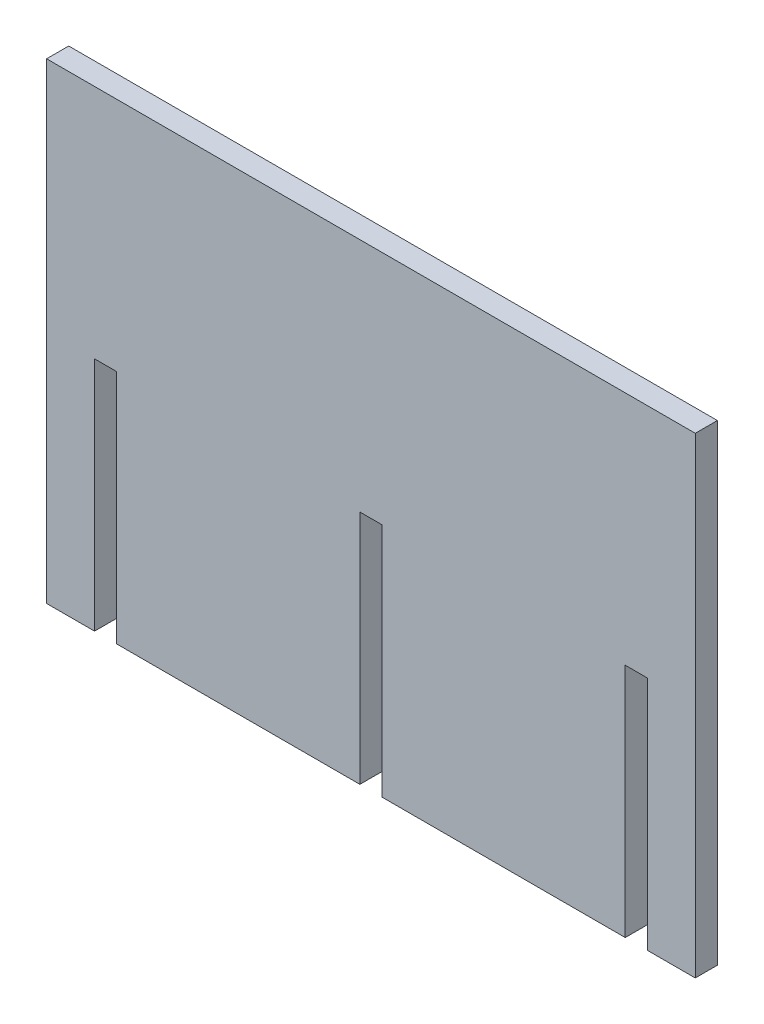
ISO-10303-21;
HEADER;
FILE_DESCRIPTION(('STEP AP214'),'2;1');
FILE_NAME('part.step','',(''),(''),'','','');
FILE_SCHEMA(('AUTOMOTIVE_DESIGN { 1 0 10303 214 1 1 1 1 }'));
ENDSEC;
DATA;
#1=APPLICATION_CONTEXT('core data for automotive mechanical design processes');
#2=APPLICATION_PROTOCOL_DEFINITION('international standard','automotive_design',2000,#1);
#3=PRODUCT_CONTEXT('',#1,'mechanical');
#4=PRODUCT('Part','Part','',(#3));
#5=PRODUCT_RELATED_PRODUCT_CATEGORY('part','',(#4));
#6=PRODUCT_DEFINITION_FORMATION('','',#4);
#7=PRODUCT_DEFINITION_CONTEXT('part definition',#1,'design');
#8=PRODUCT_DEFINITION('design','',#6,#7);
#9=PRODUCT_DEFINITION_SHAPE('','',#8);
#10=(LENGTH_UNIT() NAMED_UNIT(*) SI_UNIT(.MILLI.,.METRE.));
#11=(NAMED_UNIT(*) PLANE_ANGLE_UNIT() SI_UNIT($,.RADIAN.));
#12=(NAMED_UNIT(*) SI_UNIT($,.STERADIAN.) SOLID_ANGLE_UNIT());
#13=UNCERTAINTY_MEASURE_WITH_UNIT(LENGTH_MEASURE(1.E-05),#10,'distance_accuracy_value','');
#14=(GEOMETRIC_REPRESENTATION_CONTEXT(3) GLOBAL_UNCERTAINTY_ASSIGNED_CONTEXT((#13)) GLOBAL_UNIT_ASSIGNED_CONTEXT((#10,
#11,#12)) REPRESENTATION_CONTEXT('',''));
#15=CARTESIAN_POINT('',(0.,0.,0.));
#16=DIRECTION('',(0.,0.,1.));
#17=DIRECTION('',(1.,0.,0.));
#18=AXIS2_PLACEMENT_3D('',#15,#16,#17);
#19=CARTESIAN_POINT('',(-69.85,-50.8,4.7625));
#20=DIRECTION('',(0.,1.,0.));
#21=DIRECTION('',(0.,0.,1.));
#22=AXIS2_PLACEMENT_3D('',#19,#20,#21);
#23=PLANE('',#22);
#24=DIRECTION('',(1.,0.,0.));
#25=VECTOR('',#24,1.);
#26=CARTESIAN_POINT('',(-69.85,-50.8,4.7625));
#27=LINE('',#26,#25);
#28=CARTESIAN_POINT('',(59.53125,-50.8,4.7625));
#29=VERTEX_POINT('',#28);
#30=CARTESIAN_POINT('',(69.85,-50.8,4.7625));
#31=VERTEX_POINT('',#30);
#32=EDGE_CURVE('E249',#29,#31,#27,.T.);
#33=ORIENTED_EDGE('',*,*,#32,.F.);
#34=DIRECTION('',(0.,0.,-1.));
#35=VECTOR('',#34,1.);
#36=CARTESIAN_POINT('',(59.53125,-50.8,4.7625));
#37=LINE('',#36,#35);
#38=CARTESIAN_POINT('',(59.53125,-50.8,0.));
#39=VERTEX_POINT('',#38);
#40=EDGE_CURVE('E217',#29,#39,#37,.T.);
#41=ORIENTED_EDGE('',*,*,#40,.T.);
#42=DIRECTION('',(1.,0.,0.));
#43=VECTOR('',#42,1.);
#44=CARTESIAN_POINT('',(-69.85,-50.8,0.));
#45=LINE('',#44,#43);
#46=CARTESIAN_POINT('',(69.85,-50.8,0.));
#47=VERTEX_POINT('',#46);
#48=EDGE_CURVE('E164',#39,#47,#45,.T.);
#49=ORIENTED_EDGE('',*,*,#48,.T.);
#50=DIRECTION('',(0.,0.,-1.));
#51=VECTOR('',#50,1.);
#52=CARTESIAN_POINT('',(69.85,-50.8,4.7625));
#53=LINE('',#52,#51);
#54=EDGE_CURVE('E253',#31,#47,#53,.T.);
#55=ORIENTED_EDGE('',*,*,#54,.F.);
#56=EDGE_LOOP('',(#33,#41,#49,#55));
#57=FACE_BOUND('',#56,.T.);
#58=ADVANCED_FACE('F32',(#57),#23,.F.);
#59=CARTESIAN_POINT('',(2.38125000000001,-50.8,0.));
#60=VERTEX_POINT('',#59);
#61=CARTESIAN_POINT('',(54.76875,-50.8,0.));
#62=VERTEX_POINT('',#61);
#63=EDGE_CURVE('E170',#60,#62,#45,.T.);
#64=ORIENTED_EDGE('',*,*,#63,.T.);
#65=DIRECTION('',(0.,0.,1.));
#66=VECTOR('',#65,1.);
#67=CARTESIAN_POINT('',(54.76875,-50.8,4.7625));
#68=LINE('',#67,#66);
#69=CARTESIAN_POINT('',(54.76875,-50.8,4.7625));
#70=VERTEX_POINT('',#69);
#71=EDGE_CURVE('E303',#62,#70,#68,.T.);
#72=ORIENTED_EDGE('',*,*,#71,.T.);
#73=CARTESIAN_POINT('',(2.38125000000001,-50.8,4.7625));
#74=VERTEX_POINT('',#73);
#75=EDGE_CURVE('E296',#74,#70,#27,.T.);
#76=ORIENTED_EDGE('',*,*,#75,.F.);
#77=DIRECTION('',(0.,0.,-1.));
#78=VECTOR('',#77,1.);
#79=CARTESIAN_POINT('',(2.38124999999999,-50.8,4.7625));
#80=LINE('',#79,#78);
#81=EDGE_CURVE('E223',#74,#60,#80,.T.);
#82=ORIENTED_EDGE('',*,*,#81,.T.);
#83=EDGE_LOOP('',(#64,#72,#76,#82));
#84=FACE_BOUND('',#83,.T.);
#85=ADVANCED_FACE('F293',(#84),#23,.F.);
#86=CARTESIAN_POINT('',(-54.76875,-50.8,0.));
#87=VERTEX_POINT('',#86);
#88=CARTESIAN_POINT('',(-2.38124999999999,-50.8,0.));
#89=VERTEX_POINT('',#88);
#90=EDGE_CURVE('E175',#87,#89,#45,.T.);
#91=ORIENTED_EDGE('',*,*,#90,.T.);
#92=DIRECTION('',(0.,0.,1.));
#93=VECTOR('',#92,1.);
#94=CARTESIAN_POINT('',(-2.38125000000002,-50.8,4.7625));
#95=LINE('',#94,#93);
#96=CARTESIAN_POINT('',(-2.38124999999999,-50.8,4.7625));
#97=VERTEX_POINT('',#96);
#98=EDGE_CURVE('E195',#89,#97,#95,.T.);
#99=ORIENTED_EDGE('',*,*,#98,.T.);
#100=CARTESIAN_POINT('',(-54.76875,-50.8,4.7625));
#101=VERTEX_POINT('',#100);
#102=EDGE_CURVE('E254',#101,#97,#27,.T.);
#103=ORIENTED_EDGE('',*,*,#102,.F.);
#104=DIRECTION('',(0.,0.,-1.));
#105=VECTOR('',#104,1.);
#106=CARTESIAN_POINT('',(-54.76875,-50.8,4.7625));
#107=LINE('',#106,#105);
#108=EDGE_CURVE('E197',#101,#87,#107,.T.);
#109=ORIENTED_EDGE('',*,*,#108,.T.);
#110=EDGE_LOOP('',(#91,#99,#103,#109));
#111=FACE_BOUND('',#110,.T.);
#112=ADVANCED_FACE('F193',(#111),#23,.F.);
#113=CARTESIAN_POINT('',(69.85,-50.8,4.7625));
#114=DIRECTION('',(-1.,0.,0.));
#115=DIRECTION('',(0.,0.,1.));
#116=AXIS2_PLACEMENT_3D('',#113,#114,#115);
#117=PLANE('',#116);
#118=DIRECTION('',(0.,1.,0.));
#119=VECTOR('',#118,1.);
#120=CARTESIAN_POINT('',(69.85,-50.8,0.));
#121=LINE('',#120,#119);
#122=CARTESIAN_POINT('',(69.85,50.8,0.));
#123=VERTEX_POINT('',#122);
#124=EDGE_CURVE('E166',#47,#123,#121,.T.);
#125=ORIENTED_EDGE('',*,*,#124,.T.);
#126=DIRECTION('',(0.,0.,-1.));
#127=VECTOR('',#126,1.);
#128=CARTESIAN_POINT('',(69.85,50.8,4.7625));
#129=LINE('',#128,#127);
#130=CARTESIAN_POINT('',(69.85,50.8,4.7625));
#131=VERTEX_POINT('',#130);
#132=EDGE_CURVE('E264',#131,#123,#129,.T.);
#133=ORIENTED_EDGE('',*,*,#132,.F.);
#134=DIRECTION('',(0.,1.,0.));
#135=VECTOR('',#134,1.);
#136=CARTESIAN_POINT('',(69.85,-50.8,4.7625));
#137=LINE('',#136,#135);
#138=EDGE_CURVE('E180',#31,#131,#137,.T.);
#139=ORIENTED_EDGE('',*,*,#138,.F.);
#140=ORIENTED_EDGE('',*,*,#54,.T.);
#141=EDGE_LOOP('',(#125,#133,#139,#140));
#142=FACE_BOUND('',#141,.T.);
#143=ADVANCED_FACE('F34',(#142),#117,.F.);
#144=CARTESIAN_POINT('',(-69.85,50.8,4.7625));
#145=DIRECTION('',(0.,-1.,0.));
#146=DIRECTION('',(0.,0.,-1.));
#147=AXIS2_PLACEMENT_3D('',#144,#145,#146);
#148=PLANE('',#147);
#149=DIRECTION('',(-1.,0.,0.));
#150=VECTOR('',#149,1.);
#151=CARTESIAN_POINT('',(-69.85,50.8,0.));
#152=LINE('',#151,#150);
#153=CARTESIAN_POINT('',(-69.85,50.8,0.));
#154=VERTEX_POINT('',#153);
#155=EDGE_CURVE('E176',#123,#154,#152,.T.);
#156=ORIENTED_EDGE('',*,*,#155,.T.);
#157=DIRECTION('',(0.,0.,-1.));
#158=VECTOR('',#157,1.);
#159=CARTESIAN_POINT('',(-69.85,50.8,4.7625));
#160=LINE('',#159,#158);
#161=CARTESIAN_POINT('',(-69.85,50.8,4.7625));
#162=VERTEX_POINT('',#161);
#163=EDGE_CURVE('E261',#162,#154,#160,.T.);
#164=ORIENTED_EDGE('',*,*,#163,.F.);
#165=DIRECTION('',(-1.,0.,0.));
#166=VECTOR('',#165,1.);
#167=CARTESIAN_POINT('',(-69.85,50.8,4.7625));
#168=LINE('',#167,#166);
#169=EDGE_CURVE('E186',#131,#162,#168,.T.);
#170=ORIENTED_EDGE('',*,*,#169,.F.);
#171=ORIENTED_EDGE('',*,*,#132,.T.);
#172=EDGE_LOOP('',(#156,#164,#170,#171));
#173=FACE_BOUND('',#172,.T.);
#174=ADVANCED_FACE('F260',(#173),#148,.F.);
#175=CARTESIAN_POINT('',(-69.85,-50.8,4.7625));
#176=DIRECTION('',(1.,0.,0.));
#177=DIRECTION('',(0.,0.,-1.));
#178=AXIS2_PLACEMENT_3D('',#175,#176,#177);
#179=PLANE('',#178);
#180=DIRECTION('',(0.,-1.,0.));
#181=VECTOR('',#180,1.);
#182=CARTESIAN_POINT('',(-69.85,-50.8,0.));
#183=LINE('',#182,#181);
#184=CARTESIAN_POINT('',(-69.85,-50.8,0.));
#185=VERTEX_POINT('',#184);
#186=EDGE_CURVE('E171',#154,#185,#183,.T.);
#187=ORIENTED_EDGE('',*,*,#186,.T.);
#188=DIRECTION('',(0.,0.,-1.));
#189=VECTOR('',#188,1.);
#190=CARTESIAN_POINT('',(-69.85,-50.8,4.7625));
#191=LINE('',#190,#189);
#192=CARTESIAN_POINT('',(-69.85,-50.8,4.7625));
#193=VERTEX_POINT('',#192);
#194=EDGE_CURVE('E269',#193,#185,#191,.T.);
#195=ORIENTED_EDGE('',*,*,#194,.F.);
#196=DIRECTION('',(0.,-1.,0.));
#197=VECTOR('',#196,1.);
#198=CARTESIAN_POINT('',(-69.85,-50.8,4.7625));
#199=LINE('',#198,#197);
#200=EDGE_CURVE('E247',#162,#193,#199,.T.);
#201=ORIENTED_EDGE('',*,*,#200,.F.);
#202=ORIENTED_EDGE('',*,*,#163,.T.);
#203=EDGE_LOOP('',(#187,#195,#201,#202));
#204=FACE_BOUND('',#203,.T.);
#205=ADVANCED_FACE('F267',(#204),#179,.F.);
#206=CARTESIAN_POINT('',(-59.53125,-50.8,0.));
#207=VERTEX_POINT('',#206);
#208=EDGE_CURVE('E173',#185,#207,#45,.T.);
#209=ORIENTED_EDGE('',*,*,#208,.T.);
#210=DIRECTION('',(0.,0.,1.));
#211=VECTOR('',#210,1.);
#212=CARTESIAN_POINT('',(-59.53125,-50.8,4.7625));
#213=LINE('',#212,#211);
#214=CARTESIAN_POINT('',(-59.53125,-50.8,4.7625));
#215=VERTEX_POINT('',#214);
#216=EDGE_CURVE('E241',#207,#215,#213,.T.);
#217=ORIENTED_EDGE('',*,*,#216,.T.);
#218=EDGE_CURVE('E250',#193,#215,#27,.T.);
#219=ORIENTED_EDGE('',*,*,#218,.F.);
#220=ORIENTED_EDGE('',*,*,#194,.T.);
#221=EDGE_LOOP('',(#209,#217,#219,#220));
#222=FACE_BOUND('',#221,.T.);
#223=ADVANCED_FACE('F283',(#222),#23,.F.);
#224=CARTESIAN_POINT('',(0.,0.,4.7625));
#225=DIRECTION('',(0.,0.,-1.));
#226=DIRECTION('',(-1.,0.,0.));
#227=AXIS2_PLACEMENT_3D('',#224,#225,#226);
#228=PLANE('',#227);
#229=DIRECTION('',(-1.,0.,0.));
#230=VECTOR('',#229,1.);
#231=CARTESIAN_POINT('',(54.76875,0.,4.7625));
#232=LINE('',#231,#230);
#233=CARTESIAN_POINT('',(59.53125,0.,4.7625));
#234=VERTEX_POINT('',#233);
#235=CARTESIAN_POINT('',(54.76875,0.,4.7625));
#236=VERTEX_POINT('',#235);
#237=EDGE_CURVE('E300',#234,#236,#232,.T.);
#238=ORIENTED_EDGE('',*,*,#237,.F.);
#239=DIRECTION('',(0.,1.,0.));
#240=VECTOR('',#239,1.);
#241=CARTESIAN_POINT('',(59.53125,-101.6,4.7625));
#242=LINE('',#241,#240);
#243=EDGE_CURVE('E149',#29,#234,#242,.T.);
#244=ORIENTED_EDGE('',*,*,#243,.F.);
#245=ORIENTED_EDGE('',*,*,#32,.T.);
#246=ORIENTED_EDGE('',*,*,#138,.T.);
#247=ORIENTED_EDGE('',*,*,#169,.T.);
#248=ORIENTED_EDGE('',*,*,#200,.T.);
#249=ORIENTED_EDGE('',*,*,#218,.T.);
#250=DIRECTION('',(0.,-1.,0.));
#251=VECTOR('',#250,1.);
#252=CARTESIAN_POINT('',(-59.53125,-101.6,4.7625));
#253=LINE('',#252,#251);
#254=CARTESIAN_POINT('',(-59.53125,0.,4.7625));
#255=VERTEX_POINT('',#254);
#256=EDGE_CURVE('E230',#255,#215,#253,.T.);
#257=ORIENTED_EDGE('',*,*,#256,.F.);
#258=DIRECTION('',(-1.,0.,0.));
#259=VECTOR('',#258,1.);
#260=CARTESIAN_POINT('',(-59.53125,0.,4.7625));
#261=LINE('',#260,#259);
#262=CARTESIAN_POINT('',(-54.76875,0.,4.7625));
#263=VERTEX_POINT('',#262);
#264=EDGE_CURVE('E235',#263,#255,#261,.T.);
#265=ORIENTED_EDGE('',*,*,#264,.F.);
#266=DIRECTION('',(0.,1.,0.));
#267=VECTOR('',#266,1.);
#268=CARTESIAN_POINT('',(-54.76875,-101.6,4.7625));
#269=LINE('',#268,#267);
#270=EDGE_CURVE('E226',#101,#263,#269,.T.);
#271=ORIENTED_EDGE('',*,*,#270,.F.);
#272=ORIENTED_EDGE('',*,*,#102,.T.);
#273=DIRECTION('',(0.,-1.,0.));
#274=VECTOR('',#273,1.);
#275=CARTESIAN_POINT('',(-2.38124999999999,-101.6,4.7625));
#276=LINE('',#275,#274);
#277=CARTESIAN_POINT('',(-2.38124999999999,0.,4.7625));
#278=VERTEX_POINT('',#277);
#279=EDGE_CURVE('E210',#278,#97,#276,.T.);
#280=ORIENTED_EDGE('',*,*,#279,.F.);
#281=DIRECTION('',(-1.,0.,0.));
#282=VECTOR('',#281,1.);
#283=CARTESIAN_POINT('',(-2.38124999999999,0.,4.7625));
#284=LINE('',#283,#282);
#285=CARTESIAN_POINT('',(2.38125000000001,0.,4.7625));
#286=VERTEX_POINT('',#285);
#287=EDGE_CURVE('E216',#286,#278,#284,.T.);
#288=ORIENTED_EDGE('',*,*,#287,.F.);
#289=DIRECTION('',(0.,1.,0.));
#290=VECTOR('',#289,1.);
#291=CARTESIAN_POINT('',(2.38125000000001,-101.6,4.7625));
#292=LINE('',#291,#290);
#293=EDGE_CURVE('E214',#74,#286,#292,.T.);
#294=ORIENTED_EDGE('',*,*,#293,.F.);
#295=ORIENTED_EDGE('',*,*,#75,.T.);
#296=DIRECTION('',(0.,-1.,0.));
#297=VECTOR('',#296,1.);
#298=CARTESIAN_POINT('',(54.76875,-101.6,4.7625));
#299=LINE('',#298,#297);
#300=EDGE_CURVE('E159',#236,#70,#299,.T.);
#301=ORIENTED_EDGE('',*,*,#300,.F.);
#302=EDGE_LOOP('',(#238,#244,#245,#246,#247,#248,#249,#257,#265,#271,#272,#280,#288,#294,#295,#301));
#303=FACE_BOUND('',#302,.T.);
#304=ADVANCED_FACE('F281',(#303),#228,.F.);
#305=CARTESIAN_POINT('',(0.,0.,0.));
#306=DIRECTION('',(0.,0.,-1.));
#307=DIRECTION('',(-1.,0.,0.));
#308=AXIS2_PLACEMENT_3D('',#305,#306,#307);
#309=PLANE('',#308);
#310=DIRECTION('',(0.,-1.,0.));
#311=VECTOR('',#310,1.);
#312=CARTESIAN_POINT('',(59.53125,0.,0.));
#313=LINE('',#312,#311);
#314=CARTESIAN_POINT('',(59.53125,0.,0.));
#315=VERTEX_POINT('',#314);
#316=EDGE_CURVE('E11',#315,#39,#313,.T.);
#317=ORIENTED_EDGE('',*,*,#316,.F.);
#318=DIRECTION('',(-1.,0.,0.));
#319=VECTOR('',#318,1.);
#320=CARTESIAN_POINT('',(54.76875,0.,0.));
#321=LINE('',#320,#319);
#322=CARTESIAN_POINT('',(54.76875,0.,0.));
#323=VERTEX_POINT('',#322);
#324=EDGE_CURVE('E156',#315,#323,#321,.T.);
#325=ORIENTED_EDGE('',*,*,#324,.T.);
#326=DIRECTION('',(0.,-1.,0.));
#327=VECTOR('',#326,1.);
#328=CARTESIAN_POINT('',(54.76875,-101.6,0.));
#329=LINE('',#328,#327);
#330=EDGE_CURVE('E47',#323,#62,#329,.T.);
#331=ORIENTED_EDGE('',*,*,#330,.T.);
#332=ORIENTED_EDGE('',*,*,#63,.F.);
#333=DIRECTION('',(0.,-1.,0.));
#334=VECTOR('',#333,1.);
#335=CARTESIAN_POINT('',(2.38125000000001,0.,0.));
#336=LINE('',#335,#334);
#337=CARTESIAN_POINT('',(2.38125000000001,0.,0.));
#338=VERTEX_POINT('',#337);
#339=EDGE_CURVE('E40',#338,#60,#336,.T.);
#340=ORIENTED_EDGE('',*,*,#339,.F.);
#341=DIRECTION('',(-1.,0.,0.));
#342=VECTOR('',#341,1.);
#343=CARTESIAN_POINT('',(-2.38124999999999,0.,0.));
#344=LINE('',#343,#342);
#345=CARTESIAN_POINT('',(-2.38124999999999,0.,0.));
#346=VERTEX_POINT('',#345);
#347=EDGE_CURVE('E204',#338,#346,#344,.T.);
#348=ORIENTED_EDGE('',*,*,#347,.T.);
#349=DIRECTION('',(0.,-1.,0.));
#350=VECTOR('',#349,1.);
#351=CARTESIAN_POINT('',(-2.38124999999999,-101.6,0.));
#352=LINE('',#351,#350);
#353=EDGE_CURVE('E55',#346,#89,#352,.T.);
#354=ORIENTED_EDGE('',*,*,#353,.T.);
#355=ORIENTED_EDGE('',*,*,#90,.F.);
#356=DIRECTION('',(0.,-1.,0.));
#357=VECTOR('',#356,1.);
#358=CARTESIAN_POINT('',(-54.76875,0.,0.));
#359=LINE('',#358,#357);
#360=CARTESIAN_POINT('',(-54.76875,0.,0.));
#361=VERTEX_POINT('',#360);
#362=EDGE_CURVE('E200',#361,#87,#359,.T.);
#363=ORIENTED_EDGE('',*,*,#362,.F.);
#364=DIRECTION('',(-1.,0.,0.));
#365=VECTOR('',#364,1.);
#366=CARTESIAN_POINT('',(-59.53125,0.,0.));
#367=LINE('',#366,#365);
#368=CARTESIAN_POINT('',(-59.53125,0.,0.));
#369=VERTEX_POINT('',#368);
#370=EDGE_CURVE('E227',#361,#369,#367,.T.);
#371=ORIENTED_EDGE('',*,*,#370,.T.);
#372=DIRECTION('',(0.,-1.,0.));
#373=VECTOR('',#372,1.);
#374=CARTESIAN_POINT('',(-59.53125,-101.6,0.));
#375=LINE('',#374,#373);
#376=EDGE_CURVE('E229',#369,#207,#375,.T.);
#377=ORIENTED_EDGE('',*,*,#376,.T.);
#378=ORIENTED_EDGE('',*,*,#208,.F.);
#379=ORIENTED_EDGE('',*,*,#186,.F.);
#380=ORIENTED_EDGE('',*,*,#155,.F.);
#381=ORIENTED_EDGE('',*,*,#124,.F.);
#382=ORIENTED_EDGE('',*,*,#48,.F.);
#383=EDGE_LOOP('',(#317,#325,#331,#332,#340,#348,#354,#355,#363,#371,#377,#378,#379,#380,#381,#382));
#384=FACE_BOUND('',#383,.T.);
#385=ADVANCED_FACE('F162',(#384),#309,.T.);
#386=CARTESIAN_POINT('',(-54.76875,-101.6,0.));
#387=DIRECTION('',(1.,0.,0.));
#388=DIRECTION('',(0.,0.,-1.));
#389=AXIS2_PLACEMENT_3D('',#386,#387,#388);
#390=PLANE('',#389);
#391=ORIENTED_EDGE('',*,*,#270,.T.);
#392=DIRECTION('',(0.,0.,1.));
#393=VECTOR('',#392,1.);
#394=CARTESIAN_POINT('',(-54.76875,0.,0.));
#395=LINE('',#394,#393);
#396=EDGE_CURVE('E233',#361,#263,#395,.T.);
#397=ORIENTED_EDGE('',*,*,#396,.F.);
#398=ORIENTED_EDGE('',*,*,#362,.T.);
#399=ORIENTED_EDGE('',*,*,#108,.F.);
#400=EDGE_LOOP('',(#391,#397,#398,#399));
#401=FACE_BOUND('',#400,.T.);
#402=ADVANCED_FACE('F355',(#401),#390,.F.);
#403=CARTESIAN_POINT('',(-59.53125,-101.6,0.));
#404=DIRECTION('',(-1.,0.,0.));
#405=DIRECTION('',(0.,0.,1.));
#406=AXIS2_PLACEMENT_3D('',#403,#404,#405);
#407=PLANE('',#406);
#408=ORIENTED_EDGE('',*,*,#376,.F.);
#409=DIRECTION('',(0.,0.,1.));
#410=VECTOR('',#409,1.);
#411=CARTESIAN_POINT('',(-59.53125,0.,0.));
#412=LINE('',#411,#410);
#413=EDGE_CURVE('E239',#369,#255,#412,.T.);
#414=ORIENTED_EDGE('',*,*,#413,.T.);
#415=ORIENTED_EDGE('',*,*,#256,.T.);
#416=ORIENTED_EDGE('',*,*,#216,.F.);
#417=EDGE_LOOP('',(#408,#414,#415,#416));
#418=FACE_BOUND('',#417,.T.);
#419=ADVANCED_FACE('F274',(#418),#407,.F.);
#420=CARTESIAN_POINT('',(-59.53125,0.,0.));
#421=DIRECTION('',(0.,1.,0.));
#422=DIRECTION('',(0.,0.,1.));
#423=AXIS2_PLACEMENT_3D('',#420,#421,#422);
#424=PLANE('',#423);
#425=ORIENTED_EDGE('',*,*,#264,.T.);
#426=ORIENTED_EDGE('',*,*,#413,.F.);
#427=ORIENTED_EDGE('',*,*,#370,.F.);
#428=ORIENTED_EDGE('',*,*,#396,.T.);
#429=EDGE_LOOP('',(#425,#426,#427,#428));
#430=FACE_BOUND('',#429,.T.);
#431=ADVANCED_FACE('F276',(#430),#424,.F.);
#432=CARTESIAN_POINT('',(2.38125000000001,-101.6,0.));
#433=DIRECTION('',(1.,0.,0.));
#434=DIRECTION('',(0.,0.,-1.));
#435=AXIS2_PLACEMENT_3D('',#432,#433,#434);
#436=PLANE('',#435);
#437=ORIENTED_EDGE('',*,*,#293,.T.);
#438=DIRECTION('',(0.,0.,1.));
#439=VECTOR('',#438,1.);
#440=CARTESIAN_POINT('',(2.38125000000001,0.,0.));
#441=LINE('',#440,#439);
#442=EDGE_CURVE('E205',#338,#286,#441,.T.);
#443=ORIENTED_EDGE('',*,*,#442,.F.);
#444=ORIENTED_EDGE('',*,*,#339,.T.);
#445=ORIENTED_EDGE('',*,*,#81,.F.);
#446=EDGE_LOOP('',(#437,#443,#444,#445));
#447=FACE_BOUND('',#446,.T.);
#448=ADVANCED_FACE('F288',(#447),#436,.F.);
#449=CARTESIAN_POINT('',(-2.38124999999999,-101.6,0.));
#450=DIRECTION('',(-1.,0.,0.));
#451=DIRECTION('',(0.,0.,1.));
#452=AXIS2_PLACEMENT_3D('',#449,#450,#451);
#453=PLANE('',#452);
#454=ORIENTED_EDGE('',*,*,#353,.F.);
#455=DIRECTION('',(0.,0.,1.));
#456=VECTOR('',#455,1.);
#457=CARTESIAN_POINT('',(-2.38124999999999,0.,0.));
#458=LINE('',#457,#456);
#459=EDGE_CURVE('E208',#346,#278,#458,.T.);
#460=ORIENTED_EDGE('',*,*,#459,.T.);
#461=ORIENTED_EDGE('',*,*,#279,.T.);
#462=ORIENTED_EDGE('',*,*,#98,.F.);
#463=EDGE_LOOP('',(#454,#460,#461,#462));
#464=FACE_BOUND('',#463,.T.);
#465=ADVANCED_FACE('F411',(#464),#453,.F.);
#466=CARTESIAN_POINT('',(-2.38124999999999,0.,0.));
#467=DIRECTION('',(0.,1.,0.));
#468=DIRECTION('',(0.,0.,1.));
#469=AXIS2_PLACEMENT_3D('',#466,#467,#468);
#470=PLANE('',#469);
#471=ORIENTED_EDGE('',*,*,#287,.T.);
#472=ORIENTED_EDGE('',*,*,#459,.F.);
#473=ORIENTED_EDGE('',*,*,#347,.F.);
#474=ORIENTED_EDGE('',*,*,#442,.T.);
#475=EDGE_LOOP('',(#471,#472,#473,#474));
#476=FACE_BOUND('',#475,.T.);
#477=ADVANCED_FACE('F315',(#476),#470,.F.);
#478=CARTESIAN_POINT('',(59.53125,-101.6,0.));
#479=DIRECTION('',(1.,0.,0.));
#480=DIRECTION('',(0.,0.,-1.));
#481=AXIS2_PLACEMENT_3D('',#478,#479,#480);
#482=PLANE('',#481);
#483=ORIENTED_EDGE('',*,*,#243,.T.);
#484=DIRECTION('',(0.,0.,1.));
#485=VECTOR('',#484,1.);
#486=CARTESIAN_POINT('',(59.53125,0.,0.));
#487=LINE('',#486,#485);
#488=EDGE_CURVE('E143',#315,#234,#487,.T.);
#489=ORIENTED_EDGE('',*,*,#488,.F.);
#490=ORIENTED_EDGE('',*,*,#316,.T.);
#491=ORIENTED_EDGE('',*,*,#40,.F.);
#492=EDGE_LOOP('',(#483,#489,#490,#491));
#493=FACE_BOUND('',#492,.T.);
#494=ADVANCED_FACE('F145',(#493),#482,.F.);
#495=CARTESIAN_POINT('',(54.76875,-101.6,0.));
#496=DIRECTION('',(-1.,0.,0.));
#497=DIRECTION('',(0.,0.,1.));
#498=AXIS2_PLACEMENT_3D('',#495,#496,#497);
#499=PLANE('',#498);
#500=ORIENTED_EDGE('',*,*,#330,.F.);
#501=DIRECTION('',(0.,0.,1.));
#502=VECTOR('',#501,1.);
#503=CARTESIAN_POINT('',(54.76875,0.,0.));
#504=LINE('',#503,#502);
#505=EDGE_CURVE('E153',#323,#236,#504,.T.);
#506=ORIENTED_EDGE('',*,*,#505,.T.);
#507=ORIENTED_EDGE('',*,*,#300,.T.);
#508=ORIENTED_EDGE('',*,*,#71,.F.);
#509=EDGE_LOOP('',(#500,#506,#507,#508));
#510=FACE_BOUND('',#509,.T.);
#511=ADVANCED_FACE('F307',(#510),#499,.F.);
#512=CARTESIAN_POINT('',(54.76875,0.,0.));
#513=DIRECTION('',(0.,1.,0.));
#514=DIRECTION('',(0.,0.,1.));
#515=AXIS2_PLACEMENT_3D('',#512,#513,#514);
#516=PLANE('',#515);
#517=ORIENTED_EDGE('',*,*,#237,.T.);
#518=ORIENTED_EDGE('',*,*,#505,.F.);
#519=ORIENTED_EDGE('',*,*,#324,.F.);
#520=ORIENTED_EDGE('',*,*,#488,.T.);
#521=EDGE_LOOP('',(#517,#518,#519,#520));
#522=FACE_BOUND('',#521,.T.);
#523=ADVANCED_FACE('F157',(#522),#516,.F.);
#524=CLOSED_SHELL('',(#58,#85,#112,#143,#174,#205,#223,#304,#385,#402,#419,#431,#448,#465,#477,
#494,#511,#523));
#525=MANIFOLD_SOLID_BREP('B2',#524);
#526=ADVANCED_BREP_SHAPE_REPRESENTATION('',(#18,#525),#14);
#527=SHAPE_DEFINITION_REPRESENTATION(#9,#526);
ENDSEC;
END-ISO-10303-21;
